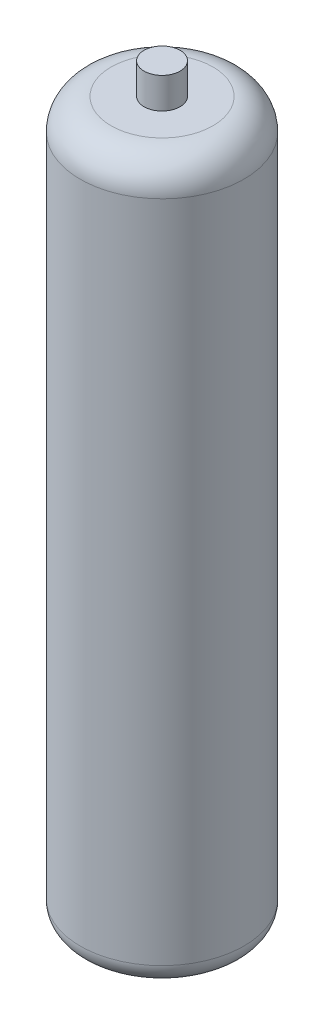
ISO-10303-21;
HEADER;
FILE_DESCRIPTION(('STEP AP214'),'2;1');
FILE_NAME('part.step','',(''),(''),'','','');
FILE_SCHEMA(('AUTOMOTIVE_DESIGN { 1 0 10303 214 1 1 1 1 }'));
ENDSEC;
DATA;
#1=APPLICATION_CONTEXT('core data for automotive mechanical design processes');
#2=APPLICATION_PROTOCOL_DEFINITION('international standard','automotive_design',2000,#1);
#3=PRODUCT_CONTEXT('',#1,'mechanical');
#4=PRODUCT('Part','Part','',(#3));
#5=PRODUCT_RELATED_PRODUCT_CATEGORY('part','',(#4));
#6=PRODUCT_DEFINITION_FORMATION('','',#4);
#7=PRODUCT_DEFINITION_CONTEXT('part definition',#1,'design');
#8=PRODUCT_DEFINITION('design','',#6,#7);
#9=PRODUCT_DEFINITION_SHAPE('','',#8);
#10=(LENGTH_UNIT() NAMED_UNIT(*) SI_UNIT(.MILLI.,.METRE.));
#11=(NAMED_UNIT(*) PLANE_ANGLE_UNIT() SI_UNIT($,.RADIAN.));
#12=(NAMED_UNIT(*) SI_UNIT($,.STERADIAN.) SOLID_ANGLE_UNIT());
#13=UNCERTAINTY_MEASURE_WITH_UNIT(LENGTH_MEASURE(1.E-05),#10,'distance_accuracy_value','');
#14=(GEOMETRIC_REPRESENTATION_CONTEXT(3) GLOBAL_UNCERTAINTY_ASSIGNED_CONTEXT((#13)) GLOBAL_UNIT_ASSIGNED_CONTEXT((#10,
#11,#12)) REPRESENTATION_CONTEXT('',''));
#15=CARTESIAN_POINT('',(0.,0.,0.));
#16=DIRECTION('',(0.,0.,1.));
#17=DIRECTION('',(1.,0.,0.));
#18=AXIS2_PLACEMENT_3D('',#15,#16,#17);
#19=CARTESIAN_POINT('',(0.,377.5,0.));
#20=DIRECTION('',(0.,1.,0.));
#21=DIRECTION('',(0.,0.,1.));
#22=AXIS2_PLACEMENT_3D('',#19,#20,#21);
#23=PLANE('',#22);
#24=CARTESIAN_POINT('',(0.,377.5,0.));
#25=DIRECTION('',(0.,-1.,0.));
#26=DIRECTION('',(0.,0.,-1.));
#27=AXIS2_PLACEMENT_3D('',#24,#25,#26);
#28=CIRCLE('',#27,17.5);
#29=CARTESIAN_POINT('',(0.,377.5,-17.5));
#30=VERTEX_POINT('',#29);
#31=EDGE_CURVE('E194',#30,#30,#28,.T.);
#32=ORIENTED_EDGE('',*,*,#31,.F.);
#33=EDGE_LOOP('',(#32));
#34=FACE_BOUND('',#33,.T.);
#35=ADVANCED_FACE('F17',(#34),#23,.T.);
#36=CARTESIAN_POINT('',(0.,377.5,0.));
#37=DIRECTION('',(0.,-1.,0.));
#38=DIRECTION('',(0.,0.,-1.));
#39=AXIS2_PLACEMENT_3D('',#36,#37,#38);
#40=CYLINDRICAL_SURFACE('',#39,17.5);
#41=CARTESIAN_POINT('',(0.,347.5,0.));
#42=DIRECTION('',(0.,-1.,0.));
#43=DIRECTION('',(0.,0.,-1.));
#44=AXIS2_PLACEMENT_3D('',#41,#42,#43);
#45=CIRCLE('',#44,17.5);
#46=CARTESIAN_POINT('',(0.,347.5,-17.5));
#47=VERTEX_POINT('',#46);
#48=EDGE_CURVE('E52',#47,#47,#45,.T.);
#49=ORIENTED_EDGE('',*,*,#48,.F.);
#50=EDGE_LOOP('',(#49));
#51=FACE_BOUND('',#50,.T.);
#52=ORIENTED_EDGE('',*,*,#31,.T.);
#53=EDGE_LOOP('',(#52));
#54=FACE_BOUND('',#53,.T.);
#55=ADVANCED_FACE('F122',(#51,#54),#40,.T.);
#56=CARTESIAN_POINT('',(0.,347.5,0.));
#57=DIRECTION('',(0.,1.,0.));
#58=DIRECTION('',(0.,0.,1.));
#59=AXIS2_PLACEMENT_3D('',#56,#57,#58);
#60=PLANE('',#59);
#61=ORIENTED_EDGE('',*,*,#48,.T.);
#62=EDGE_LOOP('',(#61));
#63=FACE_BOUND('',#62,.T.);
#64=CARTESIAN_POINT('',(0.,347.5,0.));
#65=DIRECTION('',(0.,-1.,0.));
#66=DIRECTION('',(0.,0.,-1.));
#67=AXIS2_PLACEMENT_3D('',#64,#65,#66);
#68=CIRCLE('',#67,49.5);
#69=CARTESIAN_POINT('',(0.,347.5,-49.5));
#70=VERTEX_POINT('',#69);
#71=CARTESIAN_POINT('',(0.,347.5,49.5));
#72=VERTEX_POINT('',#71);
#73=EDGE_CURVE('E50',#70,#72,#68,.T.);
#74=ORIENTED_EDGE('',*,*,#73,.F.);
#75=CARTESIAN_POINT('',(0.,347.5,0.));
#76=DIRECTION('',(0.,-1.,0.));
#77=DIRECTION('',(0.,0.,1.));
#78=AXIS2_PLACEMENT_3D('',#75,#76,#77);
#79=CIRCLE('',#78,49.5);
#80=EDGE_CURVE('E45',#72,#70,#79,.T.);
#81=ORIENTED_EDGE('',*,*,#80,.F.);
#82=EDGE_LOOP('',(#74,#81));
#83=FACE_BOUND('',#82,.T.);
#84=ADVANCED_FACE('F49',(#63,#83),#60,.T.);
#85=CARTESIAN_POINT('',(0.,-347.5,0.));
#86=DIRECTION('',(0.,1.,0.));
#87=DIRECTION('',(0.,0.,1.));
#88=AXIS2_PLACEMENT_3D('',#85,#86,#87);
#89=PLANE('',#88);
#90=CARTESIAN_POINT('',(0.,-347.5,0.));
#91=DIRECTION('',(0.,1.,0.));
#92=DIRECTION('',(0.,0.,1.));
#93=AXIS2_PLACEMENT_3D('',#90,#91,#92);
#94=CIRCLE('',#93,59.5);
#95=CARTESIAN_POINT('',(0.,-347.5,59.5));
#96=VERTEX_POINT('',#95);
#97=CARTESIAN_POINT('',(0.,-347.5,-59.5));
#98=VERTEX_POINT('',#97);
#99=EDGE_CURVE('E58',#96,#98,#94,.T.);
#100=ORIENTED_EDGE('',*,*,#99,.F.);
#101=CARTESIAN_POINT('',(0.,-347.5,0.));
#102=DIRECTION('',(0.,1.,0.));
#103=DIRECTION('',(0.,0.,-1.));
#104=AXIS2_PLACEMENT_3D('',#101,#102,#103);
#105=CIRCLE('',#104,59.5);
#106=EDGE_CURVE('E36',#98,#96,#105,.T.);
#107=ORIENTED_EDGE('',*,*,#106,.F.);
#108=EDGE_LOOP('',(#100,#107));
#109=FACE_BOUND('',#108,.T.);
#110=ADVANCED_FACE('F78',(#109),#89,.F.);
#111=CARTESIAN_POINT('',(0.,317.5,0.));
#112=DIRECTION('',(0.,1.,0.));
#113=DIRECTION('',(0.,0.,1.));
#114=AXIS2_PLACEMENT_3D('',#111,#112,#113);
#115=TOROIDAL_SURFACE('',#114,49.5,30.);
#116=ORIENTED_EDGE('',*,*,#80,.T.);
#117=ORIENTED_EDGE('',*,*,#73,.T.);
#118=EDGE_LOOP('',(#116,#117));
#119=FACE_BOUND('',#118,.T.);
#120=CARTESIAN_POINT('',(0.,317.5,0.));
#121=DIRECTION('',(0.,-1.,0.));
#122=DIRECTION('',(0.,0.,-1.));
#123=AXIS2_PLACEMENT_3D('',#120,#121,#122);
#124=CIRCLE('',#123,79.5);
#125=CARTESIAN_POINT('',(0.,317.5,-79.5));
#126=VERTEX_POINT('',#125);
#127=EDGE_CURVE('E28',#126,#126,#124,.T.);
#128=ORIENTED_EDGE('',*,*,#127,.F.);
#129=EDGE_LOOP('',(#128));
#130=FACE_BOUND('',#129,.T.);
#131=ADVANCED_FACE('F56',(#119,#130),#115,.T.);
#132=CARTESIAN_POINT('',(0.,-327.5,0.));
#133=DIRECTION('',(0.,1.,0.));
#134=DIRECTION('',(0.,0.,1.));
#135=AXIS2_PLACEMENT_3D('',#132,#133,#134);
#136=TOROIDAL_SURFACE('',#135,59.5,20.);
#137=CARTESIAN_POINT('',(0.,-327.5,0.));
#138=DIRECTION('',(0.,-1.,0.));
#139=DIRECTION('',(0.,0.,-1.));
#140=AXIS2_PLACEMENT_3D('',#137,#138,#139);
#141=CIRCLE('',#140,79.5);
#142=CARTESIAN_POINT('',(0.,-327.5,-79.5));
#143=VERTEX_POINT('',#142);
#144=EDGE_CURVE('E11',#143,#143,#141,.F.);
#145=ORIENTED_EDGE('',*,*,#144,.F.);
#146=EDGE_LOOP('',(#145));
#147=FACE_BOUND('',#146,.T.);
#148=ORIENTED_EDGE('',*,*,#99,.T.);
#149=ORIENTED_EDGE('',*,*,#106,.T.);
#150=EDGE_LOOP('',(#148,#149));
#151=FACE_BOUND('',#150,.T.);
#152=ADVANCED_FACE('F77',(#147,#151),#136,.T.);
#153=CARTESIAN_POINT('',(0.,347.5,0.));
#154=DIRECTION('',(0.,-1.,0.));
#155=DIRECTION('',(0.,0.,-1.));
#156=AXIS2_PLACEMENT_3D('',#153,#154,#155);
#157=CYLINDRICAL_SURFACE('',#156,79.5);
#158=ORIENTED_EDGE('',*,*,#144,.T.);
#159=EDGE_LOOP('',(#158));
#160=FACE_BOUND('',#159,.T.);
#161=ORIENTED_EDGE('',*,*,#127,.T.);
#162=EDGE_LOOP('',(#161));
#163=FACE_BOUND('',#162,.T.);
#164=ADVANCED_FACE('F135',(#160,#163),#157,.T.);
#165=CLOSED_SHELL('',(#35,#55,#84,#110,#131,#152,#164));
#166=MANIFOLD_SOLID_BREP('B1',#165);
#167=ADVANCED_BREP_SHAPE_REPRESENTATION('',(#18,#166),#14);
#168=SHAPE_DEFINITION_REPRESENTATION(#9,#167);
ENDSEC;
END-ISO-10303-21;
